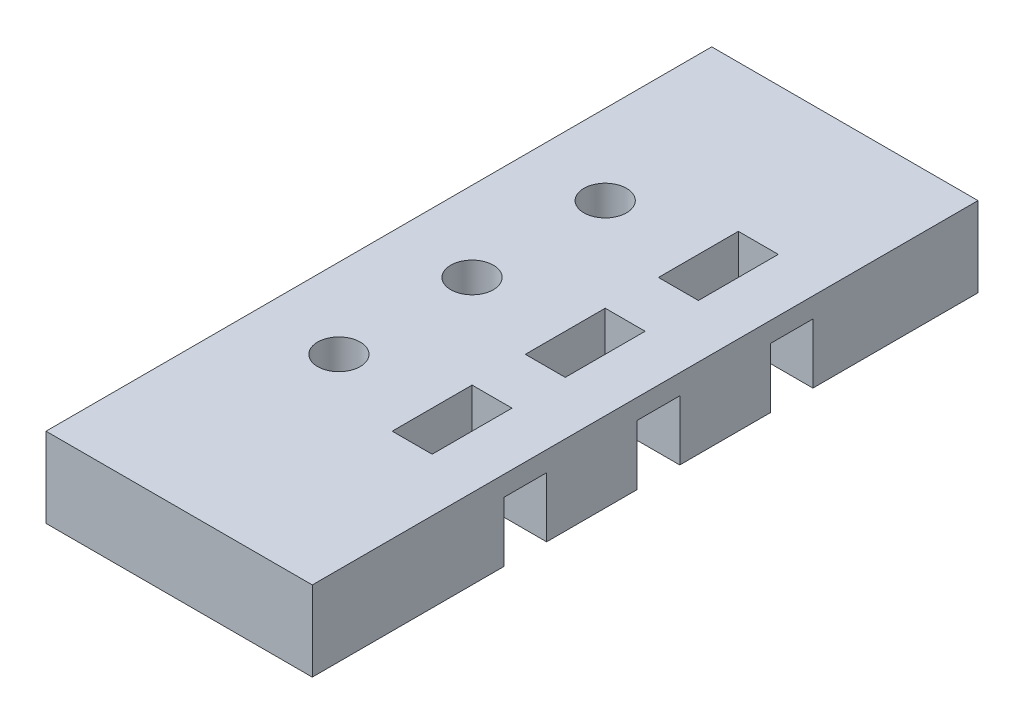
ISO-10303-21;
HEADER;
FILE_DESCRIPTION(('STEP AP214'),'2;1');
FILE_NAME('part.step','',(''),(''),'','','');
FILE_SCHEMA(('AUTOMOTIVE_DESIGN { 1 0 10303 214 1 1 1 1 }'));
ENDSEC;
DATA;
#1=APPLICATION_CONTEXT('core data for automotive mechanical design processes');
#2=APPLICATION_PROTOCOL_DEFINITION('international standard','automotive_design',2000,#1);
#3=PRODUCT_CONTEXT('',#1,'mechanical');
#4=PRODUCT('Part','Part','',(#3));
#5=PRODUCT_RELATED_PRODUCT_CATEGORY('part','',(#4));
#6=PRODUCT_DEFINITION_FORMATION('','',#4);
#7=PRODUCT_DEFINITION_CONTEXT('part definition',#1,'design');
#8=PRODUCT_DEFINITION('design','',#6,#7);
#9=PRODUCT_DEFINITION_SHAPE('','',#8);
#10=(LENGTH_UNIT() NAMED_UNIT(*) SI_UNIT(.MILLI.,.METRE.));
#11=(NAMED_UNIT(*) PLANE_ANGLE_UNIT() SI_UNIT($,.RADIAN.));
#12=(NAMED_UNIT(*) SI_UNIT($,.STERADIAN.) SOLID_ANGLE_UNIT());
#13=UNCERTAINTY_MEASURE_WITH_UNIT(LENGTH_MEASURE(1.E-05),#10,'distance_accuracy_value','');
#14=(GEOMETRIC_REPRESENTATION_CONTEXT(3) GLOBAL_UNCERTAINTY_ASSIGNED_CONTEXT((#13)) GLOBAL_UNIT_ASSIGNED_CONTEXT((#10,
#11,#12)) REPRESENTATION_CONTEXT('',''));
#15=CARTESIAN_POINT('',(0.,0.,0.));
#16=DIRECTION('',(0.,0.,1.));
#17=DIRECTION('',(1.,0.,0.));
#18=AXIS2_PLACEMENT_3D('',#15,#16,#17);
#19=CARTESIAN_POINT('',(6.0000000000001,14.5,-26.));
#20=DIRECTION('',(0.,-1.,0.));
#21=DIRECTION('',(0.,0.,-1.));
#22=AXIS2_PLACEMENT_3D('',#19,#20,#21);
#23=CYLINDRICAL_SURFACE('',#22,1.6);
#24=CARTESIAN_POINT('',(6.0000000000001,6.,-26.));
#25=DIRECTION('',(0.,-1.,0.));
#26=DIRECTION('',(0.,0.,-1.));
#27=AXIS2_PLACEMENT_3D('',#24,#25,#26);
#28=CIRCLE('',#27,1.6);
#29=CARTESIAN_POINT('',(6.0000000000001,6.,-27.6));
#30=VERTEX_POINT('',#29);
#31=EDGE_CURVE('E315',#30,#30,#28,.T.);
#32=ORIENTED_EDGE('',*,*,#31,.F.);
#33=EDGE_LOOP('',(#32));
#34=FACE_BOUND('',#33,.T.);
#35=CARTESIAN_POINT('',(6.0000000000001,3.,-26.));
#36=DIRECTION('',(0.,-1.,0.));
#37=DIRECTION('',(0.,0.,-1.));
#38=AXIS2_PLACEMENT_3D('',#35,#36,#37);
#39=CIRCLE('',#38,1.6);
#40=CARTESIAN_POINT('',(6.0000000000001,3.,-27.6));
#41=VERTEX_POINT('',#40);
#42=EDGE_CURVE('E43',#41,#41,#39,.F.);
#43=ORIENTED_EDGE('',*,*,#42,.F.);
#44=EDGE_LOOP('',(#43));
#45=FACE_BOUND('',#44,.T.);
#46=ADVANCED_FACE('F39',(#34,#45),#23,.F.);
#47=CARTESIAN_POINT('',(6.,14.5,-16.));
#48=DIRECTION('',(0.,-1.,0.));
#49=DIRECTION('',(0.,0.,-1.));
#50=AXIS2_PLACEMENT_3D('',#47,#48,#49);
#51=CYLINDRICAL_SURFACE('',#50,1.6);
#52=CARTESIAN_POINT('',(6.,6.,-16.));
#53=DIRECTION('',(0.,-1.,0.));
#54=DIRECTION('',(0.,0.,-1.));
#55=AXIS2_PLACEMENT_3D('',#52,#53,#54);
#56=CIRCLE('',#55,1.6);
#57=CARTESIAN_POINT('',(6.,6.,-17.6));
#58=VERTEX_POINT('',#57);
#59=EDGE_CURVE('E324',#58,#58,#56,.T.);
#60=ORIENTED_EDGE('',*,*,#59,.F.);
#61=EDGE_LOOP('',(#60));
#62=FACE_BOUND('',#61,.T.);
#63=CARTESIAN_POINT('',(6.,3.,-16.));
#64=DIRECTION('',(0.,-1.,0.));
#65=DIRECTION('',(0.,0.,-1.));
#66=AXIS2_PLACEMENT_3D('',#63,#64,#65);
#67=CIRCLE('',#66,1.6);
#68=CARTESIAN_POINT('',(6.,3.,-17.6));
#69=VERTEX_POINT('',#68);
#70=EDGE_CURVE('E451',#69,#69,#67,.F.);
#71=ORIENTED_EDGE('',*,*,#70,.F.);
#72=EDGE_LOOP('',(#71));
#73=FACE_BOUND('',#72,.T.);
#74=ADVANCED_FACE('F462',(#62,#73),#51,.F.);
#75=CARTESIAN_POINT('',(6.00000000000021,14.5,-36.));
#76=DIRECTION('',(0.,-1.,0.));
#77=DIRECTION('',(0.,0.,-1.));
#78=AXIS2_PLACEMENT_3D('',#75,#76,#77);
#79=CYLINDRICAL_SURFACE('',#78,1.6);
#80=CARTESIAN_POINT('',(6.00000000000021,6.,-36.));
#81=DIRECTION('',(0.,-1.,0.));
#82=DIRECTION('',(0.,0.,-1.));
#83=AXIS2_PLACEMENT_3D('',#80,#81,#82);
#84=CIRCLE('',#83,1.6);
#85=CARTESIAN_POINT('',(6.00000000000021,6.,-37.6));
#86=VERTEX_POINT('',#85);
#87=EDGE_CURVE('E336',#86,#86,#84,.T.);
#88=ORIENTED_EDGE('',*,*,#87,.F.);
#89=EDGE_LOOP('',(#88));
#90=FACE_BOUND('',#89,.T.);
#91=CARTESIAN_POINT('',(6.00000000000021,3.,-36.));
#92=DIRECTION('',(0.,-1.,0.));
#93=DIRECTION('',(0.,0.,-1.));
#94=AXIS2_PLACEMENT_3D('',#91,#92,#93);
#95=CIRCLE('',#94,1.6);
#96=CARTESIAN_POINT('',(6.00000000000021,3.,-37.6));
#97=VERTEX_POINT('',#96);
#98=EDGE_CURVE('E449',#97,#97,#95,.F.);
#99=ORIENTED_EDGE('',*,*,#98,.F.);
#100=EDGE_LOOP('',(#99));
#101=FACE_BOUND('',#100,.T.);
#102=ADVANCED_FACE('F469',(#90,#101),#79,.F.);
#103=CARTESIAN_POINT('',(0.,6.,0.));
#104=DIRECTION('',(1.,0.,0.));
#105=DIRECTION('',(0.,0.,-1.));
#106=AXIS2_PLACEMENT_3D('',#103,#104,#105);
#107=PLANE('',#106);
#108=DIRECTION('',(0.,0.,1.));
#109=VECTOR('',#108,1.);
#110=CARTESIAN_POINT('',(0.,0.,0.));
#111=LINE('',#110,#109);
#112=CARTESIAN_POINT('',(0.,0.,-50.));
#113=VERTEX_POINT('',#112);
#114=CARTESIAN_POINT('',(0.,0.,0.));
#115=VERTEX_POINT('',#114);
#116=EDGE_CURVE('E414',#113,#115,#111,.T.);
#117=ORIENTED_EDGE('',*,*,#116,.T.);
#118=DIRECTION('',(0.,-1.,0.));
#119=VECTOR('',#118,1.);
#120=CARTESIAN_POINT('',(0.,6.,0.));
#121=LINE('',#120,#119);
#122=CARTESIAN_POINT('',(0.,6.,0.));
#123=VERTEX_POINT('',#122);
#124=EDGE_CURVE('E11',#123,#115,#121,.T.);
#125=ORIENTED_EDGE('',*,*,#124,.F.);
#126=DIRECTION('',(0.,0.,1.));
#127=VECTOR('',#126,1.);
#128=CARTESIAN_POINT('',(0.,6.,0.));
#129=LINE('',#128,#127);
#130=CARTESIAN_POINT('',(0.,6.,-50.));
#131=VERTEX_POINT('',#130);
#132=EDGE_CURVE('E421',#131,#123,#129,.T.);
#133=ORIENTED_EDGE('',*,*,#132,.F.);
#134=DIRECTION('',(0.,-1.,0.));
#135=VECTOR('',#134,1.);
#136=CARTESIAN_POINT('',(0.,6.,-50.));
#137=LINE('',#136,#135);
#138=EDGE_CURVE('E431',#131,#113,#137,.T.);
#139=ORIENTED_EDGE('',*,*,#138,.T.);
#140=EDGE_LOOP('',(#117,#125,#133,#139));
#141=FACE_BOUND('',#140,.T.);
#142=ADVANCED_FACE('F41',(#141),#107,.F.);
#143=CARTESIAN_POINT('',(0.,6.,0.));
#144=DIRECTION('',(0.,0.,-1.));
#145=DIRECTION('',(-1.,0.,0.));
#146=AXIS2_PLACEMENT_3D('',#143,#144,#145);
#147=PLANE('',#146);
#148=DIRECTION('',(1.,0.,0.));
#149=VECTOR('',#148,1.);
#150=CARTESIAN_POINT('',(0.,0.,0.));
#151=LINE('',#150,#149);
#152=CARTESIAN_POINT('',(20.,0.,0.));
#153=VERTEX_POINT('',#152);
#154=EDGE_CURVE('E434',#115,#153,#151,.T.);
#155=ORIENTED_EDGE('',*,*,#154,.T.);
#156=DIRECTION('',(0.,-1.,0.));
#157=VECTOR('',#156,1.);
#158=CARTESIAN_POINT('',(20.,6.,0.));
#159=LINE('',#158,#157);
#160=CARTESIAN_POINT('',(20.,6.,0.));
#161=VERTEX_POINT('',#160);
#162=EDGE_CURVE('E48',#161,#153,#159,.T.);
#163=ORIENTED_EDGE('',*,*,#162,.F.);
#164=DIRECTION('',(1.,0.,0.));
#165=VECTOR('',#164,1.);
#166=CARTESIAN_POINT('',(0.,6.,0.));
#167=LINE('',#166,#165);
#168=EDGE_CURVE('E424',#123,#161,#167,.T.);
#169=ORIENTED_EDGE('',*,*,#168,.F.);
#170=ORIENTED_EDGE('',*,*,#124,.T.);
#171=EDGE_LOOP('',(#155,#163,#169,#170));
#172=FACE_BOUND('',#171,.T.);
#173=ADVANCED_FACE('F561',(#172),#147,.F.);
#174=CARTESIAN_POINT('',(20.,6.,0.));
#175=DIRECTION('',(-1.,0.,0.));
#176=DIRECTION('',(0.,0.,1.));
#177=AXIS2_PLACEMENT_3D('',#174,#175,#176);
#178=PLANE('',#177);
#179=DIRECTION('',(0.,0.,1.));
#180=VECTOR('',#179,1.);
#181=CARTESIAN_POINT('',(20.,4.5,-17.6));
#182=LINE('',#181,#180);
#183=CARTESIAN_POINT('',(20.,4.5,-17.6));
#184=VERTEX_POINT('',#183);
#185=CARTESIAN_POINT('',(20.,4.5,-14.4));
#186=VERTEX_POINT('',#185);
#187=EDGE_CURVE('E389',#184,#186,#182,.T.);
#188=ORIENTED_EDGE('',*,*,#187,.F.);
#189=DIRECTION('',(0.,-1.,0.));
#190=VECTOR('',#189,1.);
#191=CARTESIAN_POINT('',(20.,4.5,-17.6));
#192=LINE('',#191,#190);
#193=CARTESIAN_POINT('',(20.,0.,-17.6));
#194=VERTEX_POINT('',#193);
#195=EDGE_CURVE('E369',#184,#194,#192,.T.);
#196=ORIENTED_EDGE('',*,*,#195,.T.);
#197=DIRECTION('',(0.,0.,-1.));
#198=VECTOR('',#197,1.);
#199=CARTESIAN_POINT('',(20.,0.,0.));
#200=LINE('',#199,#198);
#201=CARTESIAN_POINT('',(20.,0.,-24.4));
#202=VERTEX_POINT('',#201);
#203=EDGE_CURVE('E440',#194,#202,#200,.T.);
#204=ORIENTED_EDGE('',*,*,#203,.T.);
#205=DIRECTION('',(0.,-1.,0.));
#206=VECTOR('',#205,1.);
#207=CARTESIAN_POINT('',(20.,4.5,-24.4));
#208=LINE('',#207,#206);
#209=CARTESIAN_POINT('',(20.,4.5,-24.4));
#210=VERTEX_POINT('',#209);
#211=EDGE_CURVE('E407',#210,#202,#208,.T.);
#212=ORIENTED_EDGE('',*,*,#211,.F.);
#213=DIRECTION('',(0.,0.,1.));
#214=VECTOR('',#213,1.);
#215=CARTESIAN_POINT('',(20.,4.5,-27.6));
#216=LINE('',#215,#214);
#217=CARTESIAN_POINT('',(20.,4.5,-27.6));
#218=VERTEX_POINT('',#217);
#219=EDGE_CURVE('E394',#218,#210,#216,.T.);
#220=ORIENTED_EDGE('',*,*,#219,.F.);
#221=DIRECTION('',(0.,-1.,0.));
#222=VECTOR('',#221,1.);
#223=CARTESIAN_POINT('',(20.,4.5,-27.6));
#224=LINE('',#223,#222);
#225=CARTESIAN_POINT('',(20.,0.,-27.6));
#226=VERTEX_POINT('',#225);
#227=EDGE_CURVE('E411',#218,#226,#224,.T.);
#228=ORIENTED_EDGE('',*,*,#227,.T.);
#229=CARTESIAN_POINT('',(20.,0.,-34.4));
#230=VERTEX_POINT('',#229);
#231=EDGE_CURVE('E586',#226,#230,#200,.T.);
#232=ORIENTED_EDGE('',*,*,#231,.T.);
#233=DIRECTION('',(0.,-1.,0.));
#234=VECTOR('',#233,1.);
#235=CARTESIAN_POINT('',(20.0000000000001,4.5,-34.4));
#236=LINE('',#235,#234);
#237=CARTESIAN_POINT('',(20.0000000000001,4.5,-34.4));
#238=VERTEX_POINT('',#237);
#239=EDGE_CURVE('E344',#238,#230,#236,.T.);
#240=ORIENTED_EDGE('',*,*,#239,.F.);
#241=DIRECTION('',(0.,0.,1.));
#242=VECTOR('',#241,1.);
#243=CARTESIAN_POINT('',(20.0000000000001,4.5,-37.6));
#244=LINE('',#243,#242);
#245=CARTESIAN_POINT('',(20.0000000000001,4.5,-37.6));
#246=VERTEX_POINT('',#245);
#247=EDGE_CURVE('E364',#246,#238,#244,.T.);
#248=ORIENTED_EDGE('',*,*,#247,.F.);
#249=DIRECTION('',(0.,-1.,0.));
#250=VECTOR('',#249,1.);
#251=CARTESIAN_POINT('',(20.0000000000001,4.5,-37.6));
#252=LINE('',#251,#250);
#253=CARTESIAN_POINT('',(20.0000000000001,0.,-37.6));
#254=VERTEX_POINT('',#253);
#255=EDGE_CURVE('E340',#246,#254,#252,.T.);
#256=ORIENTED_EDGE('',*,*,#255,.T.);
#257=CARTESIAN_POINT('',(20.,0.,-50.));
#258=VERTEX_POINT('',#257);
#259=EDGE_CURVE('E436',#254,#258,#200,.T.);
#260=ORIENTED_EDGE('',*,*,#259,.T.);
#261=DIRECTION('',(0.,-1.,0.));
#262=VECTOR('',#261,1.);
#263=CARTESIAN_POINT('',(20.,6.,-50.));
#264=LINE('',#263,#262);
#265=CARTESIAN_POINT('',(20.,6.,-50.));
#266=VERTEX_POINT('',#265);
#267=EDGE_CURVE('E444',#266,#258,#264,.T.);
#268=ORIENTED_EDGE('',*,*,#267,.F.);
#269=DIRECTION('',(0.,0.,-1.));
#270=VECTOR('',#269,1.);
#271=CARTESIAN_POINT('',(20.,6.,0.));
#272=LINE('',#271,#270);
#273=EDGE_CURVE('E427',#161,#266,#272,.T.);
#274=ORIENTED_EDGE('',*,*,#273,.F.);
#275=ORIENTED_EDGE('',*,*,#162,.T.);
#276=CARTESIAN_POINT('',(20.,0.,-14.4));
#277=VERTEX_POINT('',#276);
#278=EDGE_CURVE('E437',#153,#277,#200,.T.);
#279=ORIENTED_EDGE('',*,*,#278,.T.);
#280=DIRECTION('',(0.,-1.,0.));
#281=VECTOR('',#280,1.);
#282=CARTESIAN_POINT('',(20.,4.5,-14.4));
#283=LINE('',#282,#281);
#284=EDGE_CURVE('E373',#186,#277,#283,.T.);
#285=ORIENTED_EDGE('',*,*,#284,.F.);
#286=EDGE_LOOP('',(#188,#196,#204,#212,#220,#228,#232,#240,#248,#256,#260,#268,#274,#275,#279,#285));
#287=FACE_BOUND('',#286,.T.);
#288=ADVANCED_FACE('F558',(#287),#178,.F.);
#289=CARTESIAN_POINT('',(0.,6.,-50.));
#290=DIRECTION('',(0.,0.,1.));
#291=DIRECTION('',(1.,0.,0.));
#292=AXIS2_PLACEMENT_3D('',#289,#290,#291);
#293=PLANE('',#292);
#294=DIRECTION('',(-1.,0.,0.));
#295=VECTOR('',#294,1.);
#296=CARTESIAN_POINT('',(0.,0.,-50.));
#297=LINE('',#296,#295);
#298=EDGE_CURVE('E425',#258,#113,#297,.T.);
#299=ORIENTED_EDGE('',*,*,#298,.T.);
#300=ORIENTED_EDGE('',*,*,#138,.F.);
#301=DIRECTION('',(-1.,0.,0.));
#302=VECTOR('',#301,1.);
#303=CARTESIAN_POINT('',(0.,6.,-50.));
#304=LINE('',#303,#302);
#305=EDGE_CURVE('E429',#266,#131,#304,.T.);
#306=ORIENTED_EDGE('',*,*,#305,.F.);
#307=ORIENTED_EDGE('',*,*,#267,.T.);
#308=EDGE_LOOP('',(#299,#300,#306,#307));
#309=FACE_BOUND('',#308,.T.);
#310=ADVANCED_FACE('F551',(#309),#293,.F.);
#311=CARTESIAN_POINT('',(0.,6.,0.));
#312=DIRECTION('',(0.,-1.,0.));
#313=DIRECTION('',(0.,0.,-1.));
#314=AXIS2_PLACEMENT_3D('',#311,#312,#313);
#315=PLANE('',#314);
#316=ORIENTED_EDGE('',*,*,#87,.T.);
#317=EDGE_LOOP('',(#316));
#318=FACE_BOUND('',#317,.T.);
#319=DIRECTION('',(0.,0.,-1.));
#320=VECTOR('',#319,1.);
#321=CARTESIAN_POINT('',(13.0000000000001,6.,0.));
#322=LINE('',#321,#320);
#323=CARTESIAN_POINT('',(13.0000000000001,6.,-23.));
#324=VERTEX_POINT('',#323);
#325=CARTESIAN_POINT('',(13.0000000000001,6.,-29.));
#326=VERTEX_POINT('',#325);
#327=EDGE_CURVE('E330',#324,#326,#322,.T.);
#328=ORIENTED_EDGE('',*,*,#327,.T.);
#329=DIRECTION('',(1.,0.,0.));
#330=VECTOR('',#329,1.);
#331=CARTESIAN_POINT('',(0.,6.,-29.));
#332=LINE('',#331,#330);
#333=CARTESIAN_POINT('',(16.0000000000001,6.,-29.));
#334=VERTEX_POINT('',#333);
#335=EDGE_CURVE('E333',#326,#334,#332,.T.);
#336=ORIENTED_EDGE('',*,*,#335,.T.);
#337=DIRECTION('',(0.,0.,1.));
#338=VECTOR('',#337,1.);
#339=CARTESIAN_POINT('',(16.0000000000001,6.,0.));
#340=LINE('',#339,#338);
#341=CARTESIAN_POINT('',(16.0000000000001,6.,-23.));
#342=VERTEX_POINT('',#341);
#343=EDGE_CURVE('E303',#334,#342,#340,.T.);
#344=ORIENTED_EDGE('',*,*,#343,.T.);
#345=DIRECTION('',(-1.,0.,0.));
#346=VECTOR('',#345,1.);
#347=CARTESIAN_POINT('',(0.,6.,-23.));
#348=LINE('',#347,#346);
#349=EDGE_CURVE('E327',#342,#324,#348,.T.);
#350=ORIENTED_EDGE('',*,*,#349,.T.);
#351=EDGE_LOOP('',(#328,#336,#344,#350));
#352=FACE_BOUND('',#351,.T.);
#353=ORIENTED_EDGE('',*,*,#59,.T.);
#354=EDGE_LOOP('',(#353));
#355=FACE_BOUND('',#354,.T.);
#356=DIRECTION('',(0.,0.,-1.));
#357=VECTOR('',#356,1.);
#358=CARTESIAN_POINT('',(13.,6.,0.));
#359=LINE('',#358,#357);
#360=CARTESIAN_POINT('',(13.,6.,-13.));
#361=VERTEX_POINT('',#360);
#362=CARTESIAN_POINT('',(13.,6.,-19.));
#363=VERTEX_POINT('',#362);
#364=EDGE_CURVE('E321',#361,#363,#359,.T.);
#365=ORIENTED_EDGE('',*,*,#364,.T.);
#366=DIRECTION('',(1.,0.,0.));
#367=VECTOR('',#366,1.);
#368=CARTESIAN_POINT('',(0.,6.,-19.));
#369=LINE('',#368,#367);
#370=CARTESIAN_POINT('',(16.,6.,-19.));
#371=VERTEX_POINT('',#370);
#372=EDGE_CURVE('E234',#363,#371,#369,.T.);
#373=ORIENTED_EDGE('',*,*,#372,.T.);
#374=DIRECTION('',(0.,0.,1.));
#375=VECTOR('',#374,1.);
#376=CARTESIAN_POINT('',(16.,6.,0.));
#377=LINE('',#376,#375);
#378=CARTESIAN_POINT('',(16.,6.,-13.));
#379=VERTEX_POINT('',#378);
#380=EDGE_CURVE('E292',#371,#379,#377,.T.);
#381=ORIENTED_EDGE('',*,*,#380,.T.);
#382=DIRECTION('',(-1.,0.,0.));
#383=VECTOR('',#382,1.);
#384=CARTESIAN_POINT('',(0.,6.,-13.));
#385=LINE('',#384,#383);
#386=EDGE_CURVE('E318',#379,#361,#385,.T.);
#387=ORIENTED_EDGE('',*,*,#386,.T.);
#388=EDGE_LOOP('',(#365,#373,#381,#387));
#389=FACE_BOUND('',#388,.T.);
#390=ORIENTED_EDGE('',*,*,#31,.T.);
#391=EDGE_LOOP('',(#390));
#392=FACE_BOUND('',#391,.T.);
#393=DIRECTION('',(1.,0.,0.));
#394=VECTOR('',#393,1.);
#395=CARTESIAN_POINT('',(0.,6.,-39.));
#396=LINE('',#395,#394);
#397=CARTESIAN_POINT('',(13.0000000000001,6.,-39.));
#398=VERTEX_POINT('',#397);
#399=CARTESIAN_POINT('',(16.0000000000001,6.,-39.));
#400=VERTEX_POINT('',#399);
#401=EDGE_CURVE('E312',#398,#400,#396,.T.);
#402=ORIENTED_EDGE('',*,*,#401,.T.);
#403=DIRECTION('',(0.,0.,1.));
#404=VECTOR('',#403,1.);
#405=CARTESIAN_POINT('',(16.0000000000001,6.,0.));
#406=LINE('',#405,#404);
#407=CARTESIAN_POINT('',(16.0000000000001,6.,-33.));
#408=VERTEX_POINT('',#407);
#409=EDGE_CURVE('E300',#400,#408,#406,.T.);
#410=ORIENTED_EDGE('',*,*,#409,.T.);
#411=DIRECTION('',(-1.,0.,0.));
#412=VECTOR('',#411,1.);
#413=CARTESIAN_POINT('',(0.,6.,-33.));
#414=LINE('',#413,#412);
#415=CARTESIAN_POINT('',(13.0000000000001,6.,-33.));
#416=VERTEX_POINT('',#415);
#417=EDGE_CURVE('E306',#408,#416,#414,.T.);
#418=ORIENTED_EDGE('',*,*,#417,.T.);
#419=DIRECTION('',(0.,0.,-1.));
#420=VECTOR('',#419,1.);
#421=CARTESIAN_POINT('',(13.0000000000001,6.,0.));
#422=LINE('',#421,#420);
#423=EDGE_CURVE('E309',#416,#398,#422,.T.);
#424=ORIENTED_EDGE('',*,*,#423,.T.);
#425=EDGE_LOOP('',(#402,#410,#418,#424));
#426=FACE_BOUND('',#425,.T.);
#427=ORIENTED_EDGE('',*,*,#132,.T.);
#428=ORIENTED_EDGE('',*,*,#168,.T.);
#429=ORIENTED_EDGE('',*,*,#273,.T.);
#430=ORIENTED_EDGE('',*,*,#305,.T.);
#431=EDGE_LOOP('',(#427,#428,#429,#430));
#432=FACE_BOUND('',#431,.T.);
#433=ADVANCED_FACE('F548',(#318,#352,#355,#389,#392,#426,#432),#315,.F.);
#434=CARTESIAN_POINT('',(0.,0.,0.));
#435=DIRECTION('',(0.,-1.,0.));
#436=DIRECTION('',(0.,0.,-1.));
#437=AXIS2_PLACEMENT_3D('',#434,#435,#436);
#438=PLANE('',#437);
#439=CARTESIAN_POINT('',(6.,0.,-16.));
#440=DIRECTION('',(0.,-1.,0.));
#441=DIRECTION('',(0.,0.,-1.));
#442=AXIS2_PLACEMENT_3D('',#439,#440,#441);
#443=CIRCLE('',#442,3.5);
#444=CARTESIAN_POINT('',(6.,0.,-19.5));
#445=VERTEX_POINT('',#444);
#446=EDGE_CURVE('E645',#445,#445,#443,.T.);
#447=ORIENTED_EDGE('',*,*,#446,.F.);
#448=EDGE_LOOP('',(#447));
#449=FACE_BOUND('',#448,.T.);
#450=CARTESIAN_POINT('',(6.0000000000001,0.,-26.));
#451=DIRECTION('',(0.,-1.,0.));
#452=DIRECTION('',(0.,0.,-1.));
#453=AXIS2_PLACEMENT_3D('',#450,#451,#452);
#454=CIRCLE('',#453,3.5);
#455=CARTESIAN_POINT('',(6.0000000000001,0.,-29.5));
#456=VERTEX_POINT('',#455);
#457=EDGE_CURVE('E642',#456,#456,#454,.T.);
#458=ORIENTED_EDGE('',*,*,#457,.F.);
#459=EDGE_LOOP('',(#458));
#460=FACE_BOUND('',#459,.T.);
#461=CARTESIAN_POINT('',(6.00000000000021,0.,-36.));
#462=DIRECTION('',(0.,-1.,0.));
#463=DIRECTION('',(0.,0.,-1.));
#464=AXIS2_PLACEMENT_3D('',#461,#462,#463);
#465=CIRCLE('',#464,3.5);
#466=CARTESIAN_POINT('',(6.00000000000021,0.,-39.5));
#467=VERTEX_POINT('',#466);
#468=EDGE_CURVE('E636',#467,#467,#465,.T.);
#469=ORIENTED_EDGE('',*,*,#468,.F.);
#470=EDGE_LOOP('',(#469));
#471=FACE_BOUND('',#470,.T.);
#472=DIRECTION('',(0.,0.,1.));
#473=VECTOR('',#472,1.);
#474=CARTESIAN_POINT('',(16.0000000000001,0.,-29.));
#475=LINE('',#474,#473);
#476=CARTESIAN_POINT('',(16.0000000000001,0.,-29.));
#477=VERTEX_POINT('',#476);
#478=CARTESIAN_POINT('',(16.0000000000001,0.,-27.6));
#479=VERTEX_POINT('',#478);
#480=EDGE_CURVE('E272',#477,#479,#475,.T.);
#481=ORIENTED_EDGE('',*,*,#480,.F.);
#482=DIRECTION('',(1.,0.,0.));
#483=VECTOR('',#482,1.);
#484=CARTESIAN_POINT('',(16.0000000000001,0.,-29.));
#485=LINE('',#484,#483);
#486=CARTESIAN_POINT('',(13.0000000000001,0.,-29.));
#487=VERTEX_POINT('',#486);
#488=EDGE_CURVE('E274',#487,#477,#485,.T.);
#489=ORIENTED_EDGE('',*,*,#488,.F.);
#490=DIRECTION('',(0.,0.,-1.));
#491=VECTOR('',#490,1.);
#492=CARTESIAN_POINT('',(13.0000000000001,0.,-29.));
#493=LINE('',#492,#491);
#494=CARTESIAN_POINT('',(13.0000000000001,0.,-23.));
#495=VERTEX_POINT('',#494);
#496=EDGE_CURVE('E263',#495,#487,#493,.T.);
#497=ORIENTED_EDGE('',*,*,#496,.F.);
#498=DIRECTION('',(-1.,0.,0.));
#499=VECTOR('',#498,1.);
#500=CARTESIAN_POINT('',(16.0000000000001,0.,-23.));
#501=LINE('',#500,#499);
#502=CARTESIAN_POINT('',(16.0000000000001,0.,-23.));
#503=VERTEX_POINT('',#502);
#504=EDGE_CURVE('E268',#503,#495,#501,.T.);
#505=ORIENTED_EDGE('',*,*,#504,.F.);
#506=CARTESIAN_POINT('',(16.0000000000001,0.,-24.4));
#507=VERTEX_POINT('',#506);
#508=EDGE_CURVE('E271',#507,#503,#475,.T.);
#509=ORIENTED_EDGE('',*,*,#508,.F.);
#510=DIRECTION('',(-1.,0.,0.));
#511=VECTOR('',#510,1.);
#512=CARTESIAN_POINT('',(20.,0.,-24.4));
#513=LINE('',#512,#511);
#514=EDGE_CURVE('E358',#202,#507,#513,.T.);
#515=ORIENTED_EDGE('',*,*,#514,.F.);
#516=ORIENTED_EDGE('',*,*,#203,.F.);
#517=DIRECTION('',(1.,0.,0.));
#518=VECTOR('',#517,1.);
#519=CARTESIAN_POINT('',(20.,0.,-17.6));
#520=LINE('',#519,#518);
#521=CARTESIAN_POINT('',(16.,0.,-17.6));
#522=VERTEX_POINT('',#521);
#523=EDGE_CURVE('E351',#522,#194,#520,.T.);
#524=ORIENTED_EDGE('',*,*,#523,.F.);
#525=DIRECTION('',(0.,0.,1.));
#526=VECTOR('',#525,1.);
#527=CARTESIAN_POINT('',(16.,0.,-19.));
#528=LINE('',#527,#526);
#529=CARTESIAN_POINT('',(16.,0.,-19.));
#530=VERTEX_POINT('',#529);
#531=EDGE_CURVE('E252',#530,#522,#528,.T.);
#532=ORIENTED_EDGE('',*,*,#531,.F.);
#533=DIRECTION('',(1.,0.,0.));
#534=VECTOR('',#533,1.);
#535=CARTESIAN_POINT('',(16.,0.,-19.));
#536=LINE('',#535,#534);
#537=CARTESIAN_POINT('',(13.,0.,-19.));
#538=VERTEX_POINT('',#537);
#539=EDGE_CURVE('E231',#538,#530,#536,.T.);
#540=ORIENTED_EDGE('',*,*,#539,.F.);
#541=DIRECTION('',(0.,0.,-1.));
#542=VECTOR('',#541,1.);
#543=CARTESIAN_POINT('',(13.,0.,-19.));
#544=LINE('',#543,#542);
#545=CARTESIAN_POINT('',(13.,0.,-13.));
#546=VERTEX_POINT('',#545);
#547=EDGE_CURVE('E240',#546,#538,#544,.T.);
#548=ORIENTED_EDGE('',*,*,#547,.F.);
#549=DIRECTION('',(-1.,0.,0.));
#550=VECTOR('',#549,1.);
#551=CARTESIAN_POINT('',(16.,0.,-13.));
#552=LINE('',#551,#550);
#553=CARTESIAN_POINT('',(16.,0.,-13.));
#554=VERTEX_POINT('',#553);
#555=EDGE_CURVE('E246',#554,#546,#552,.T.);
#556=ORIENTED_EDGE('',*,*,#555,.F.);
#557=CARTESIAN_POINT('',(16.,0.,-14.4));
#558=VERTEX_POINT('',#557);
#559=EDGE_CURVE('E257',#558,#554,#528,.T.);
#560=ORIENTED_EDGE('',*,*,#559,.F.);
#561=DIRECTION('',(-1.,0.,0.));
#562=VECTOR('',#561,1.);
#563=CARTESIAN_POINT('',(20.,0.,-14.4));
#564=LINE('',#563,#562);
#565=EDGE_CURVE('E379',#277,#558,#564,.T.);
#566=ORIENTED_EDGE('',*,*,#565,.F.);
#567=ORIENTED_EDGE('',*,*,#278,.F.);
#568=ORIENTED_EDGE('',*,*,#154,.F.);
#569=ORIENTED_EDGE('',*,*,#116,.F.);
#570=ORIENTED_EDGE('',*,*,#298,.F.);
#571=ORIENTED_EDGE('',*,*,#259,.F.);
#572=DIRECTION('',(1.,0.,0.));
#573=VECTOR('',#572,1.);
#574=CARTESIAN_POINT('',(20.0000000000001,0.,-37.6));
#575=LINE('',#574,#573);
#576=CARTESIAN_POINT('',(16.0000000000001,0.,-37.6));
#577=VERTEX_POINT('',#576);
#578=EDGE_CURVE('E355',#577,#254,#575,.T.);
#579=ORIENTED_EDGE('',*,*,#578,.F.);
#580=DIRECTION('',(0.,0.,1.));
#581=VECTOR('',#580,1.);
#582=CARTESIAN_POINT('',(16.0000000000001,0.,-39.));
#583=LINE('',#582,#581);
#584=CARTESIAN_POINT('',(16.0000000000001,0.,-39.));
#585=VERTEX_POINT('',#584);
#586=EDGE_CURVE('E278',#585,#577,#583,.T.);
#587=ORIENTED_EDGE('',*,*,#586,.F.);
#588=DIRECTION('',(1.,0.,0.));
#589=VECTOR('',#588,1.);
#590=CARTESIAN_POINT('',(16.0000000000001,0.,-39.));
#591=LINE('',#590,#589);
#592=CARTESIAN_POINT('',(13.0000000000001,0.,-39.));
#593=VERTEX_POINT('',#592);
#594=EDGE_CURVE('E286',#593,#585,#591,.T.);
#595=ORIENTED_EDGE('',*,*,#594,.F.);
#596=DIRECTION('',(0.,0.,-1.));
#597=VECTOR('',#596,1.);
#598=CARTESIAN_POINT('',(13.0000000000001,0.,-39.));
#599=LINE('',#598,#597);
#600=CARTESIAN_POINT('',(13.0000000000001,0.,-33.));
#601=VERTEX_POINT('',#600);
#602=EDGE_CURVE('E283',#601,#593,#599,.T.);
#603=ORIENTED_EDGE('',*,*,#602,.F.);
#604=DIRECTION('',(-1.,0.,0.));
#605=VECTOR('',#604,1.);
#606=CARTESIAN_POINT('',(16.0000000000001,0.,-33.));
#607=LINE('',#606,#605);
#608=CARTESIAN_POINT('',(16.0000000000001,0.,-33.));
#609=VERTEX_POINT('',#608);
#610=EDGE_CURVE('E280',#609,#601,#607,.T.);
#611=ORIENTED_EDGE('',*,*,#610,.F.);
#612=CARTESIAN_POINT('',(16.0000000000001,0.,-34.4));
#613=VERTEX_POINT('',#612);
#614=EDGE_CURVE('E277',#613,#609,#583,.T.);
#615=ORIENTED_EDGE('',*,*,#614,.F.);
#616=DIRECTION('',(-1.,0.,0.));
#617=VECTOR('',#616,1.);
#618=CARTESIAN_POINT('',(20.0000000000001,0.,-34.4));
#619=LINE('',#618,#617);
#620=EDGE_CURVE('E352',#230,#613,#619,.T.);
#621=ORIENTED_EDGE('',*,*,#620,.F.);
#622=ORIENTED_EDGE('',*,*,#231,.F.);
#623=DIRECTION('',(1.,0.,0.));
#624=VECTOR('',#623,1.);
#625=CARTESIAN_POINT('',(20.,0.,-27.6));
#626=LINE('',#625,#624);
#627=EDGE_CURVE('E398',#479,#226,#626,.T.);
#628=ORIENTED_EDGE('',*,*,#627,.F.);
#629=EDGE_LOOP('',(#481,#489,#497,#505,#509,#515,#516,#524,#532,#540,#548,#556,#560,#566,#567,
#568,#569,#570,#571,#579,#587,#595,#603,#611,#615,#621,#622,#628));
#630=FACE_BOUND('',#629,.T.);
#631=ADVANCED_FACE('F250',(#449,#460,#471,#630),#438,.T.);
#632=CARTESIAN_POINT('',(20.,4.5,-27.6));
#633=DIRECTION('',(0.,0.,-1.));
#634=DIRECTION('',(-1.,0.,0.));
#635=AXIS2_PLACEMENT_3D('',#632,#633,#634);
#636=PLANE('',#635);
#637=ORIENTED_EDGE('',*,*,#627,.T.);
#638=ORIENTED_EDGE('',*,*,#227,.F.);
#639=DIRECTION('',(1.,0.,0.));
#640=VECTOR('',#639,1.);
#641=CARTESIAN_POINT('',(20.,4.5,-27.6));
#642=LINE('',#641,#640);
#643=CARTESIAN_POINT('',(16.,4.5,-27.6));
#644=VERTEX_POINT('',#643);
#645=EDGE_CURVE('E404',#644,#218,#642,.T.);
#646=ORIENTED_EDGE('',*,*,#645,.F.);
#647=DIRECTION('',(0.,-1.,0.));
#648=VECTOR('',#647,1.);
#649=CARTESIAN_POINT('',(16.,4.5,-27.6));
#650=LINE('',#649,#648);
#651=EDGE_CURVE('E415',#644,#479,#650,.T.);
#652=ORIENTED_EDGE('',*,*,#651,.T.);
#653=EDGE_LOOP('',(#637,#638,#646,#652));
#654=FACE_BOUND('',#653,.T.);
#655=ADVANCED_FACE('F541',(#654),#636,.F.);
#656=CARTESIAN_POINT('',(20.,4.5,-24.4));
#657=DIRECTION('',(0.,0.,1.));
#658=DIRECTION('',(1.,0.,0.));
#659=AXIS2_PLACEMENT_3D('',#656,#657,#658);
#660=PLANE('',#659);
#661=ORIENTED_EDGE('',*,*,#514,.T.);
#662=DIRECTION('',(0.,-1.,0.));
#663=VECTOR('',#662,1.);
#664=CARTESIAN_POINT('',(16.,4.5,-24.4));
#665=LINE('',#664,#663);
#666=CARTESIAN_POINT('',(16.0000000000001,4.5,-24.4));
#667=VERTEX_POINT('',#666);
#668=EDGE_CURVE('E418',#667,#507,#665,.T.);
#669=ORIENTED_EDGE('',*,*,#668,.F.);
#670=DIRECTION('',(-1.,0.,0.));
#671=VECTOR('',#670,1.);
#672=CARTESIAN_POINT('',(20.,4.5,-24.4));
#673=LINE('',#672,#671);
#674=EDGE_CURVE('E397',#210,#667,#673,.T.);
#675=ORIENTED_EDGE('',*,*,#674,.F.);
#676=ORIENTED_EDGE('',*,*,#211,.T.);
#677=EDGE_LOOP('',(#661,#669,#675,#676));
#678=FACE_BOUND('',#677,.T.);
#679=ADVANCED_FACE('F539',(#678),#660,.F.);
#680=CARTESIAN_POINT('',(0.,4.5,0.));
#681=DIRECTION('',(0.,-1.,0.));
#682=DIRECTION('',(0.,0.,-1.));
#683=AXIS2_PLACEMENT_3D('',#680,#681,#682);
#684=PLANE('',#683);
#685=ORIENTED_EDGE('',*,*,#219,.T.);
#686=ORIENTED_EDGE('',*,*,#674,.T.);
#687=DIRECTION('',(0.,0.,-1.));
#688=VECTOR('',#687,1.);
#689=CARTESIAN_POINT('',(16.,4.5,-27.6));
#690=LINE('',#689,#688);
#691=EDGE_CURVE('E401',#667,#644,#690,.T.);
#692=ORIENTED_EDGE('',*,*,#691,.T.);
#693=ORIENTED_EDGE('',*,*,#645,.T.);
#694=EDGE_LOOP('',(#685,#686,#692,#693));
#695=FACE_BOUND('',#694,.T.);
#696=ADVANCED_FACE('F516',(#695),#684,.T.);
#697=CARTESIAN_POINT('',(20.0000000000001,4.5,-37.6));
#698=DIRECTION('',(0.,0.,-1.));
#699=DIRECTION('',(-1.,0.,0.));
#700=AXIS2_PLACEMENT_3D('',#697,#698,#699);
#701=PLANE('',#700);
#702=ORIENTED_EDGE('',*,*,#578,.T.);
#703=ORIENTED_EDGE('',*,*,#255,.F.);
#704=DIRECTION('',(1.,0.,0.));
#705=VECTOR('',#704,1.);
#706=CARTESIAN_POINT('',(20.0000000000001,4.5,-37.6));
#707=LINE('',#706,#705);
#708=CARTESIAN_POINT('',(16.0000000000001,4.5,-37.6));
#709=VERTEX_POINT('',#708);
#710=EDGE_CURVE('E356',#709,#246,#707,.T.);
#711=ORIENTED_EDGE('',*,*,#710,.F.);
#712=DIRECTION('',(0.,-1.,0.));
#713=VECTOR('',#712,1.);
#714=CARTESIAN_POINT('',(16.0000000000001,4.5,-37.6));
#715=LINE('',#714,#713);
#716=EDGE_CURVE('E348',#709,#577,#715,.T.);
#717=ORIENTED_EDGE('',*,*,#716,.T.);
#718=EDGE_LOOP('',(#702,#703,#711,#717));
#719=FACE_BOUND('',#718,.T.);
#720=ADVANCED_FACE('F512',(#719),#701,.F.);
#721=CARTESIAN_POINT('',(20.0000000000001,4.5,-34.4));
#722=DIRECTION('',(0.,0.,1.));
#723=DIRECTION('',(1.,0.,0.));
#724=AXIS2_PLACEMENT_3D('',#721,#722,#723);
#725=PLANE('',#724);
#726=ORIENTED_EDGE('',*,*,#620,.T.);
#727=DIRECTION('',(0.,-1.,0.));
#728=VECTOR('',#727,1.);
#729=CARTESIAN_POINT('',(16.0000000000001,4.5,-34.4));
#730=LINE('',#729,#728);
#731=CARTESIAN_POINT('',(16.0000000000001,4.5,-34.4));
#732=VERTEX_POINT('',#731);
#733=EDGE_CURVE('E346',#732,#613,#730,.T.);
#734=ORIENTED_EDGE('',*,*,#733,.F.);
#735=DIRECTION('',(-1.,0.,0.));
#736=VECTOR('',#735,1.);
#737=CARTESIAN_POINT('',(20.0000000000001,4.5,-34.4));
#738=LINE('',#737,#736);
#739=EDGE_CURVE('E361',#238,#732,#738,.T.);
#740=ORIENTED_EDGE('',*,*,#739,.F.);
#741=ORIENTED_EDGE('',*,*,#239,.T.);
#742=EDGE_LOOP('',(#726,#734,#740,#741));
#743=FACE_BOUND('',#742,.T.);
#744=ADVANCED_FACE('F515',(#743),#725,.F.);
#745=CARTESIAN_POINT('',(0.,4.5,0.));
#746=DIRECTION('',(0.,1.,0.));
#747=DIRECTION('',(0.,0.,1.));
#748=AXIS2_PLACEMENT_3D('',#745,#746,#747);
#749=PLANE('',#748);
#750=ORIENTED_EDGE('',*,*,#710,.T.);
#751=ORIENTED_EDGE('',*,*,#247,.T.);
#752=ORIENTED_EDGE('',*,*,#739,.T.);
#753=DIRECTION('',(0.,0.,-1.));
#754=VECTOR('',#753,1.);
#755=CARTESIAN_POINT('',(16.0000000000001,4.5,-37.6));
#756=LINE('',#755,#754);
#757=EDGE_CURVE('E343',#732,#709,#756,.T.);
#758=ORIENTED_EDGE('',*,*,#757,.T.);
#759=EDGE_LOOP('',(#750,#751,#752,#758));
#760=FACE_BOUND('',#759,.T.);
#761=ADVANCED_FACE('F520',(#760),#749,.F.);
#762=CARTESIAN_POINT('',(20.,4.5,-17.6));
#763=DIRECTION('',(0.,0.,-1.));
#764=DIRECTION('',(-1.,0.,0.));
#765=AXIS2_PLACEMENT_3D('',#762,#763,#764);
#766=PLANE('',#765);
#767=ORIENTED_EDGE('',*,*,#523,.T.);
#768=ORIENTED_EDGE('',*,*,#195,.F.);
#769=DIRECTION('',(1.,0.,0.));
#770=VECTOR('',#769,1.);
#771=CARTESIAN_POINT('',(20.,4.5,-17.6));
#772=LINE('',#771,#770);
#773=CARTESIAN_POINT('',(16.,4.5,-17.6));
#774=VERTEX_POINT('',#773);
#775=EDGE_CURVE('E382',#774,#184,#772,.T.);
#776=ORIENTED_EDGE('',*,*,#775,.F.);
#777=DIRECTION('',(0.,-1.,0.));
#778=VECTOR('',#777,1.);
#779=CARTESIAN_POINT('',(16.,4.5,-17.6));
#780=LINE('',#779,#778);
#781=EDGE_CURVE('E339',#774,#522,#780,.T.);
#782=ORIENTED_EDGE('',*,*,#781,.T.);
#783=EDGE_LOOP('',(#767,#768,#776,#782));
#784=FACE_BOUND('',#783,.T.);
#785=ADVANCED_FACE('F524',(#784),#766,.F.);
#786=CARTESIAN_POINT('',(20.,4.5,-14.4));
#787=DIRECTION('',(0.,0.,1.));
#788=DIRECTION('',(1.,0.,0.));
#789=AXIS2_PLACEMENT_3D('',#786,#787,#788);
#790=PLANE('',#789);
#791=ORIENTED_EDGE('',*,*,#565,.T.);
#792=DIRECTION('',(0.,-1.,0.));
#793=VECTOR('',#792,1.);
#794=CARTESIAN_POINT('',(16.,4.5,-14.4));
#795=LINE('',#794,#793);
#796=CARTESIAN_POINT('',(16.,4.5,-14.4));
#797=VERTEX_POINT('',#796);
#798=EDGE_CURVE('E375',#797,#558,#795,.T.);
#799=ORIENTED_EDGE('',*,*,#798,.F.);
#800=DIRECTION('',(-1.,0.,0.));
#801=VECTOR('',#800,1.);
#802=CARTESIAN_POINT('',(20.,4.5,-14.4));
#803=LINE('',#802,#801);
#804=EDGE_CURVE('E386',#186,#797,#803,.T.);
#805=ORIENTED_EDGE('',*,*,#804,.F.);
#806=ORIENTED_EDGE('',*,*,#284,.T.);
#807=EDGE_LOOP('',(#791,#799,#805,#806));
#808=FACE_BOUND('',#807,.T.);
#809=ADVANCED_FACE('F528',(#808),#790,.F.);
#810=CARTESIAN_POINT('',(0.,4.5,0.));
#811=DIRECTION('',(0.,1.,0.));
#812=DIRECTION('',(0.,0.,1.));
#813=AXIS2_PLACEMENT_3D('',#810,#811,#812);
#814=PLANE('',#813);
#815=ORIENTED_EDGE('',*,*,#775,.T.);
#816=ORIENTED_EDGE('',*,*,#187,.T.);
#817=ORIENTED_EDGE('',*,*,#804,.T.);
#818=DIRECTION('',(0.,0.,-1.));
#819=VECTOR('',#818,1.);
#820=CARTESIAN_POINT('',(16.,4.5,-17.6));
#821=LINE('',#820,#819);
#822=EDGE_CURVE('E372',#797,#774,#821,.T.);
#823=ORIENTED_EDGE('',*,*,#822,.T.);
#824=EDGE_LOOP('',(#815,#816,#817,#823));
#825=FACE_BOUND('',#824,.T.);
#826=ADVANCED_FACE('F532',(#825),#814,.F.);
#827=CARTESIAN_POINT('',(16.,14.5,-19.));
#828=DIRECTION('',(0.,0.,-1.));
#829=DIRECTION('',(-1.,0.,0.));
#830=AXIS2_PLACEMENT_3D('',#827,#828,#829);
#831=PLANE('',#830);
#832=DIRECTION('',(0.,-1.,0.));
#833=VECTOR('',#832,1.);
#834=CARTESIAN_POINT('',(13.,14.5,-19.));
#835=LINE('',#834,#833);
#836=EDGE_CURVE('E226',#363,#538,#835,.T.);
#837=ORIENTED_EDGE('',*,*,#836,.T.);
#838=ORIENTED_EDGE('',*,*,#539,.T.);
#839=DIRECTION('',(0.,-1.,0.));
#840=VECTOR('',#839,1.);
#841=CARTESIAN_POINT('',(16.,14.5,-19.));
#842=LINE('',#841,#840);
#843=EDGE_CURVE('E247',#371,#530,#842,.T.);
#844=ORIENTED_EDGE('',*,*,#843,.F.);
#845=ORIENTED_EDGE('',*,*,#372,.F.);
#846=EDGE_LOOP('',(#837,#838,#844,#845));
#847=FACE_BOUND('',#846,.T.);
#848=ADVANCED_FACE('F228',(#847),#831,.F.);
#849=CARTESIAN_POINT('',(13.,14.5,-19.));
#850=DIRECTION('',(-1.,0.,0.));
#851=DIRECTION('',(0.,0.,1.));
#852=AXIS2_PLACEMENT_3D('',#849,#850,#851);
#853=PLANE('',#852);
#854=DIRECTION('',(0.,-1.,0.));
#855=VECTOR('',#854,1.);
#856=CARTESIAN_POINT('',(13.,14.5,-13.));
#857=LINE('',#856,#855);
#858=EDGE_CURVE('E237',#361,#546,#857,.T.);
#859=ORIENTED_EDGE('',*,*,#858,.T.);
#860=ORIENTED_EDGE('',*,*,#547,.T.);
#861=ORIENTED_EDGE('',*,*,#836,.F.);
#862=ORIENTED_EDGE('',*,*,#364,.F.);
#863=EDGE_LOOP('',(#859,#860,#861,#862));
#864=FACE_BOUND('',#863,.T.);
#865=ADVANCED_FACE('F241',(#864),#853,.F.);
#866=CARTESIAN_POINT('',(16.,14.5,-13.));
#867=DIRECTION('',(0.,0.,1.));
#868=DIRECTION('',(1.,0.,0.));
#869=AXIS2_PLACEMENT_3D('',#866,#867,#868);
#870=PLANE('',#869);
#871=DIRECTION('',(0.,-1.,0.));
#872=VECTOR('',#871,1.);
#873=CARTESIAN_POINT('',(16.,14.5,-13.));
#874=LINE('',#873,#872);
#875=EDGE_CURVE('E64',#379,#554,#874,.T.);
#876=ORIENTED_EDGE('',*,*,#875,.T.);
#877=ORIENTED_EDGE('',*,*,#555,.T.);
#878=ORIENTED_EDGE('',*,*,#858,.F.);
#879=ORIENTED_EDGE('',*,*,#386,.F.);
#880=EDGE_LOOP('',(#876,#877,#878,#879));
#881=FACE_BOUND('',#880,.T.);
#882=ADVANCED_FACE('F628',(#881),#870,.F.);
#883=CARTESIAN_POINT('',(16.,14.5,-19.));
#884=DIRECTION('',(1.,0.,0.));
#885=DIRECTION('',(0.,0.,-1.));
#886=AXIS2_PLACEMENT_3D('',#883,#884,#885);
#887=PLANE('',#886);
#888=ORIENTED_EDGE('',*,*,#843,.T.);
#889=ORIENTED_EDGE('',*,*,#531,.T.);
#890=ORIENTED_EDGE('',*,*,#781,.F.);
#891=ORIENTED_EDGE('',*,*,#822,.F.);
#892=ORIENTED_EDGE('',*,*,#798,.T.);
#893=ORIENTED_EDGE('',*,*,#559,.T.);
#894=ORIENTED_EDGE('',*,*,#875,.F.);
#895=ORIENTED_EDGE('',*,*,#380,.F.);
#896=EDGE_LOOP('',(#888,#889,#890,#891,#892,#893,#894,#895));
#897=FACE_BOUND('',#896,.T.);
#898=ADVANCED_FACE('F500',(#897),#887,.F.);
#899=CARTESIAN_POINT('',(16.0000000000001,14.5,-39.));
#900=DIRECTION('',(0.,0.,-1.));
#901=DIRECTION('',(-1.,0.,0.));
#902=AXIS2_PLACEMENT_3D('',#899,#900,#901);
#903=PLANE('',#902);
#904=DIRECTION('',(0.,-1.,0.));
#905=VECTOR('',#904,1.);
#906=CARTESIAN_POINT('',(13.0000000000001,14.5,-39.));
#907=LINE('',#906,#905);
#908=EDGE_CURVE('E293',#398,#593,#907,.T.);
#909=ORIENTED_EDGE('',*,*,#908,.T.);
#910=ORIENTED_EDGE('',*,*,#594,.T.);
#911=DIRECTION('',(0.,-1.,0.));
#912=VECTOR('',#911,1.);
#913=CARTESIAN_POINT('',(16.0000000000001,14.5,-39.));
#914=LINE('',#913,#912);
#915=EDGE_CURVE('E290',#400,#585,#914,.T.);
#916=ORIENTED_EDGE('',*,*,#915,.F.);
#917=ORIENTED_EDGE('',*,*,#401,.F.);
#918=EDGE_LOOP('',(#909,#910,#916,#917));
#919=FACE_BOUND('',#918,.T.);
#920=ADVANCED_FACE('F496',(#919),#903,.F.);
#921=CARTESIAN_POINT('',(13.0000000000001,14.5,-39.));
#922=DIRECTION('',(-1.,0.,0.));
#923=DIRECTION('',(0.,0.,1.));
#924=AXIS2_PLACEMENT_3D('',#921,#922,#923);
#925=PLANE('',#924);
#926=DIRECTION('',(0.,-1.,0.));
#927=VECTOR('',#926,1.);
#928=CARTESIAN_POINT('',(13.0000000000001,14.5,-33.));
#929=LINE('',#928,#927);
#930=EDGE_CURVE('E295',#416,#601,#929,.T.);
#931=ORIENTED_EDGE('',*,*,#930,.T.);
#932=ORIENTED_EDGE('',*,*,#602,.T.);
#933=ORIENTED_EDGE('',*,*,#908,.F.);
#934=ORIENTED_EDGE('',*,*,#423,.F.);
#935=EDGE_LOOP('',(#931,#932,#933,#934));
#936=FACE_BOUND('',#935,.T.);
#937=ADVANCED_FACE('F499',(#936),#925,.F.);
#938=CARTESIAN_POINT('',(16.0000000000001,14.5,-33.));
#939=DIRECTION('',(0.,0.,1.));
#940=DIRECTION('',(1.,0.,0.));
#941=AXIS2_PLACEMENT_3D('',#938,#939,#940);
#942=PLANE('',#941);
#943=DIRECTION('',(0.,-1.,0.));
#944=VECTOR('',#943,1.);
#945=CARTESIAN_POINT('',(16.0000000000001,14.5,-33.));
#946=LINE('',#945,#944);
#947=EDGE_CURVE('E289',#408,#609,#946,.T.);
#948=ORIENTED_EDGE('',*,*,#947,.T.);
#949=ORIENTED_EDGE('',*,*,#610,.T.);
#950=ORIENTED_EDGE('',*,*,#930,.F.);
#951=ORIENTED_EDGE('',*,*,#417,.F.);
#952=EDGE_LOOP('',(#948,#949,#950,#951));
#953=FACE_BOUND('',#952,.T.);
#954=ADVANCED_FACE('F504',(#953),#942,.F.);
#955=CARTESIAN_POINT('',(16.0000000000001,14.5,-39.));
#956=DIRECTION('',(1.,0.,0.));
#957=DIRECTION('',(0.,0.,-1.));
#958=AXIS2_PLACEMENT_3D('',#955,#956,#957);
#959=PLANE('',#958);
#960=ORIENTED_EDGE('',*,*,#915,.T.);
#961=ORIENTED_EDGE('',*,*,#586,.T.);
#962=ORIENTED_EDGE('',*,*,#716,.F.);
#963=ORIENTED_EDGE('',*,*,#757,.F.);
#964=ORIENTED_EDGE('',*,*,#733,.T.);
#965=ORIENTED_EDGE('',*,*,#614,.T.);
#966=ORIENTED_EDGE('',*,*,#947,.F.);
#967=ORIENTED_EDGE('',*,*,#409,.F.);
#968=EDGE_LOOP('',(#960,#961,#962,#963,#964,#965,#966,#967));
#969=FACE_BOUND('',#968,.T.);
#970=ADVANCED_FACE('F480',(#969),#959,.F.);
#971=CARTESIAN_POINT('',(16.0000000000001,14.5,-29.));
#972=DIRECTION('',(0.,0.,-1.));
#973=DIRECTION('',(-1.,0.,0.));
#974=AXIS2_PLACEMENT_3D('',#971,#972,#973);
#975=PLANE('',#974);
#976=DIRECTION('',(0.,-1.,0.));
#977=VECTOR('',#976,1.);
#978=CARTESIAN_POINT('',(13.0000000000001,14.5,-29.));
#979=LINE('',#978,#977);
#980=EDGE_CURVE('E253',#326,#487,#979,.T.);
#981=ORIENTED_EDGE('',*,*,#980,.T.);
#982=ORIENTED_EDGE('',*,*,#488,.T.);
#983=DIRECTION('',(0.,-1.,0.));
#984=VECTOR('',#983,1.);
#985=CARTESIAN_POINT('',(16.0000000000001,14.5,-29.));
#986=LINE('',#985,#984);
#987=EDGE_CURVE('E261',#334,#477,#986,.T.);
#988=ORIENTED_EDGE('',*,*,#987,.F.);
#989=ORIENTED_EDGE('',*,*,#335,.F.);
#990=EDGE_LOOP('',(#981,#982,#988,#989));
#991=FACE_BOUND('',#990,.T.);
#992=ADVANCED_FACE('F476',(#991),#975,.F.);
#993=CARTESIAN_POINT('',(13.0000000000001,14.5,-29.));
#994=DIRECTION('',(-1.,0.,0.));
#995=DIRECTION('',(0.,0.,1.));
#996=AXIS2_PLACEMENT_3D('',#993,#994,#995);
#997=PLANE('',#996);
#998=DIRECTION('',(0.,-1.,0.));
#999=VECTOR('',#998,1.);
#1000=CARTESIAN_POINT('',(13.0000000000001,14.5,-23.));
#1001=LINE('',#1000,#999);
#1002=EDGE_CURVE('E255',#324,#495,#1001,.T.);
#1003=ORIENTED_EDGE('',*,*,#1002,.T.);
#1004=ORIENTED_EDGE('',*,*,#496,.T.);
#1005=ORIENTED_EDGE('',*,*,#980,.F.);
#1006=ORIENTED_EDGE('',*,*,#327,.F.);
#1007=EDGE_LOOP('',(#1003,#1004,#1005,#1006));
#1008=FACE_BOUND('',#1007,.T.);
#1009=ADVANCED_FACE('F479',(#1008),#997,.F.);
#1010=CARTESIAN_POINT('',(16.0000000000001,14.5,-23.));
#1011=DIRECTION('',(0.,0.,1.));
#1012=DIRECTION('',(1.,0.,0.));
#1013=AXIS2_PLACEMENT_3D('',#1010,#1011,#1012);
#1014=PLANE('',#1013);
#1015=DIRECTION('',(0.,-1.,0.));
#1016=VECTOR('',#1015,1.);
#1017=CARTESIAN_POINT('',(16.0000000000001,14.5,-23.));
#1018=LINE('',#1017,#1016);
#1019=EDGE_CURVE('E56',#342,#503,#1018,.T.);
#1020=ORIENTED_EDGE('',*,*,#1019,.T.);
#1021=ORIENTED_EDGE('',*,*,#504,.T.);
#1022=ORIENTED_EDGE('',*,*,#1002,.F.);
#1023=ORIENTED_EDGE('',*,*,#349,.F.);
#1024=EDGE_LOOP('',(#1020,#1021,#1022,#1023));
#1025=FACE_BOUND('',#1024,.T.);
#1026=ADVANCED_FACE('F486',(#1025),#1014,.F.);
#1027=CARTESIAN_POINT('',(16.0000000000001,14.5,-29.));
#1028=DIRECTION('',(1.,0.,0.));
#1029=DIRECTION('',(0.,0.,-1.));
#1030=AXIS2_PLACEMENT_3D('',#1027,#1028,#1029);
#1031=PLANE('',#1030);
#1032=ORIENTED_EDGE('',*,*,#987,.T.);
#1033=ORIENTED_EDGE('',*,*,#480,.T.);
#1034=ORIENTED_EDGE('',*,*,#651,.F.);
#1035=ORIENTED_EDGE('',*,*,#691,.F.);
#1036=ORIENTED_EDGE('',*,*,#668,.T.);
#1037=ORIENTED_EDGE('',*,*,#508,.T.);
#1038=ORIENTED_EDGE('',*,*,#1019,.F.);
#1039=ORIENTED_EDGE('',*,*,#343,.F.);
#1040=EDGE_LOOP('',(#1032,#1033,#1034,#1035,#1036,#1037,#1038,#1039));
#1041=FACE_BOUND('',#1040,.T.);
#1042=ADVANCED_FACE('F482',(#1041),#1031,.F.);
#1043=CARTESIAN_POINT('',(6.00000000000021,3.,-36.));
#1044=DIRECTION('',(0.,-1.,0.));
#1045=DIRECTION('',(0.,0.,-1.));
#1046=AXIS2_PLACEMENT_3D('',#1043,#1044,#1045);
#1047=PLANE('',#1046);
#1048=CARTESIAN_POINT('',(6.00000000000021,3.,-36.));
#1049=DIRECTION('',(0.,-1.,0.));
#1050=DIRECTION('',(0.,0.,-1.));
#1051=AXIS2_PLACEMENT_3D('',#1048,#1049,#1050);
#1052=CIRCLE('',#1051,3.5);
#1053=CARTESIAN_POINT('',(6.00000000000021,3.,-39.5));
#1054=VERTEX_POINT('',#1053);
#1055=EDGE_CURVE('E633',#1054,#1054,#1052,.T.);
#1056=ORIENTED_EDGE('',*,*,#1055,.T.);
#1057=EDGE_LOOP('',(#1056));
#1058=FACE_BOUND('',#1057,.T.);
#1059=ORIENTED_EDGE('',*,*,#98,.T.);
#1060=EDGE_LOOP('',(#1059));
#1061=FACE_BOUND('',#1060,.T.);
#1062=ADVANCED_FACE('F485',(#1058,#1061),#1047,.T.);
#1063=CARTESIAN_POINT('',(6.00000000000021,3.,-36.));
#1064=DIRECTION('',(0.,-1.,0.));
#1065=DIRECTION('',(0.,0.,-1.));
#1066=AXIS2_PLACEMENT_3D('',#1063,#1064,#1065);
#1067=CYLINDRICAL_SURFACE('',#1066,3.5);
#1068=ORIENTED_EDGE('',*,*,#1055,.F.);
#1069=EDGE_LOOP('',(#1068));
#1070=FACE_BOUND('',#1069,.T.);
#1071=ORIENTED_EDGE('',*,*,#468,.T.);
#1072=EDGE_LOOP('',(#1071));
#1073=FACE_BOUND('',#1072,.T.);
#1074=ADVANCED_FACE('F663',(#1070,#1073),#1067,.F.);
#1075=CARTESIAN_POINT('',(6.,3.,-16.));
#1076=DIRECTION('',(0.,-1.,0.));
#1077=DIRECTION('',(0.,0.,-1.));
#1078=AXIS2_PLACEMENT_3D('',#1075,#1076,#1077);
#1079=PLANE('',#1078);
#1080=CARTESIAN_POINT('',(6.,3.,-16.));
#1081=DIRECTION('',(0.,-1.,0.));
#1082=DIRECTION('',(0.,0.,-1.));
#1083=AXIS2_PLACEMENT_3D('',#1080,#1081,#1082);
#1084=CIRCLE('',#1083,3.5);
#1085=CARTESIAN_POINT('',(6.,3.,-19.5));
#1086=VERTEX_POINT('',#1085);
#1087=EDGE_CURVE('E452',#1086,#1086,#1084,.T.);
#1088=ORIENTED_EDGE('',*,*,#1087,.T.);
#1089=EDGE_LOOP('',(#1088));
#1090=FACE_BOUND('',#1089,.T.);
#1091=ORIENTED_EDGE('',*,*,#70,.T.);
#1092=EDGE_LOOP('',(#1091));
#1093=FACE_BOUND('',#1092,.T.);
#1094=ADVANCED_FACE('F651',(#1090,#1093),#1079,.T.);
#1095=CARTESIAN_POINT('',(6.,3.,-16.));
#1096=DIRECTION('',(0.,-1.,0.));
#1097=DIRECTION('',(0.,0.,-1.));
#1098=AXIS2_PLACEMENT_3D('',#1095,#1096,#1097);
#1099=CYLINDRICAL_SURFACE('',#1098,3.5);
#1100=ORIENTED_EDGE('',*,*,#1087,.F.);
#1101=EDGE_LOOP('',(#1100));
#1102=FACE_BOUND('',#1101,.T.);
#1103=ORIENTED_EDGE('',*,*,#446,.T.);
#1104=EDGE_LOOP('',(#1103));
#1105=FACE_BOUND('',#1104,.T.);
#1106=ADVANCED_FACE('F653',(#1102,#1105),#1099,.F.);
#1107=CARTESIAN_POINT('',(6.0000000000001,3.,-26.));
#1108=DIRECTION('',(0.,-1.,0.));
#1109=DIRECTION('',(0.,0.,-1.));
#1110=AXIS2_PLACEMENT_3D('',#1107,#1108,#1109);
#1111=PLANE('',#1110);
#1112=CARTESIAN_POINT('',(6.0000000000001,3.,-26.));
#1113=DIRECTION('',(0.,-1.,0.));
#1114=DIRECTION('',(0.,0.,-1.));
#1115=AXIS2_PLACEMENT_3D('',#1112,#1113,#1114);
#1116=CIRCLE('',#1115,3.5);
#1117=CARTESIAN_POINT('',(6.0000000000001,3.,-29.5));
#1118=VERTEX_POINT('',#1117);
#1119=EDGE_CURVE('E639',#1118,#1118,#1116,.T.);
#1120=ORIENTED_EDGE('',*,*,#1119,.T.);
#1121=EDGE_LOOP('',(#1120));
#1122=FACE_BOUND('',#1121,.T.);
#1123=ORIENTED_EDGE('',*,*,#42,.T.);
#1124=EDGE_LOOP('',(#1123));
#1125=FACE_BOUND('',#1124,.T.);
#1126=ADVANCED_FACE('F459',(#1122,#1125),#1111,.T.);
#1127=CARTESIAN_POINT('',(6.0000000000001,3.,-26.));
#1128=DIRECTION('',(0.,-1.,0.));
#1129=DIRECTION('',(0.,0.,-1.));
#1130=AXIS2_PLACEMENT_3D('',#1127,#1128,#1129);
#1131=CYLINDRICAL_SURFACE('',#1130,3.5);
#1132=ORIENTED_EDGE('',*,*,#1119,.F.);
#1133=EDGE_LOOP('',(#1132));
#1134=FACE_BOUND('',#1133,.T.);
#1135=ORIENTED_EDGE('',*,*,#457,.T.);
#1136=EDGE_LOOP('',(#1135));
#1137=FACE_BOUND('',#1136,.T.);
#1138=ADVANCED_FACE('F915',(#1134,#1137),#1131,.F.);
#1139=CLOSED_SHELL('',(#46,#74,#102,#142,#173,#288,#310,#433,#631,#655,#679,#696,#720,#744,#761,
#785,#809,#826,#848,#865,#882,#898,#920,#937,#954,#970,#992,#1009,#1026,#1042,#1062,#1074,#1094,
#1106,#1126,#1138));
#1140=MANIFOLD_SOLID_BREP('B2',#1139);
#1141=ADVANCED_BREP_SHAPE_REPRESENTATION('',(#18,#1140),#14);
#1142=SHAPE_DEFINITION_REPRESENTATION(#9,#1141);
ENDSEC;
END-ISO-10303-21;
